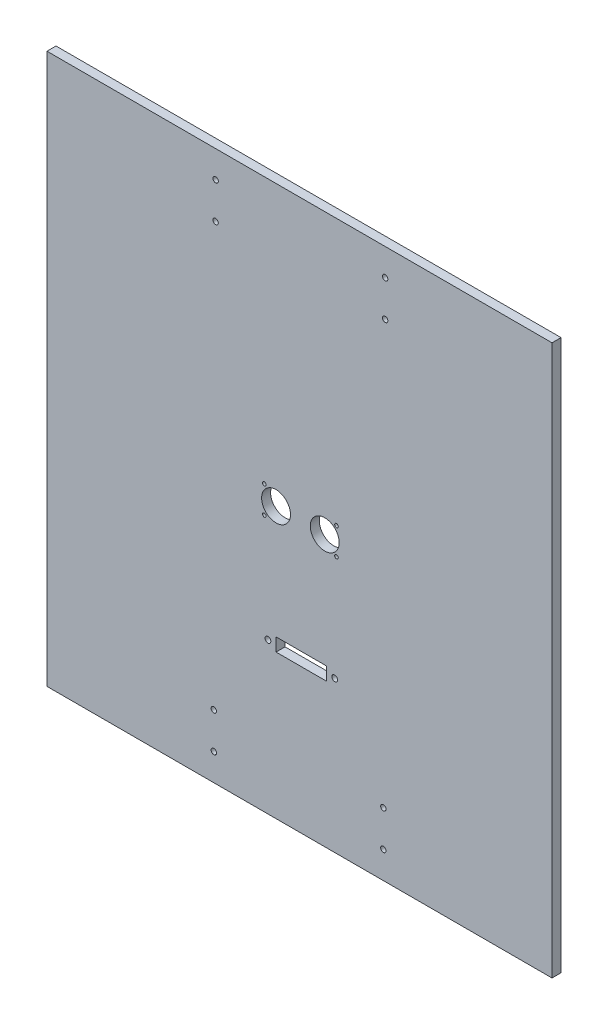
ISO-10303-21;
HEADER;
FILE_DESCRIPTION(('STEP AP214'),'2;1');
FILE_NAME('part.step','',(''),(''),'','','');
FILE_SCHEMA(('AUTOMOTIVE_DESIGN { 1 0 10303 214 1 1 1 1 }'));
ENDSEC;
DATA;
#1=APPLICATION_CONTEXT('core data for automotive mechanical design processes');
#2=APPLICATION_PROTOCOL_DEFINITION('international standard','automotive_design',2000,#1);
#3=PRODUCT_CONTEXT('',#1,'mechanical');
#4=PRODUCT('Part','Part','',(#3));
#5=PRODUCT_RELATED_PRODUCT_CATEGORY('part','',(#4));
#6=PRODUCT_DEFINITION_FORMATION('','',#4);
#7=PRODUCT_DEFINITION_CONTEXT('part definition',#1,'design');
#8=PRODUCT_DEFINITION('design','',#6,#7);
#9=PRODUCT_DEFINITION_SHAPE('','',#8);
#10=(LENGTH_UNIT() NAMED_UNIT(*) SI_UNIT(.MILLI.,.METRE.));
#11=(NAMED_UNIT(*) PLANE_ANGLE_UNIT() SI_UNIT($,.RADIAN.));
#12=(NAMED_UNIT(*) SI_UNIT($,.STERADIAN.) SOLID_ANGLE_UNIT());
#13=UNCERTAINTY_MEASURE_WITH_UNIT(LENGTH_MEASURE(1.E-05),#10,'distance_accuracy_value','');
#14=(GEOMETRIC_REPRESENTATION_CONTEXT(3) GLOBAL_UNCERTAINTY_ASSIGNED_CONTEXT((#13)) GLOBAL_UNIT_ASSIGNED_CONTEXT((#10,
#11,#12)) REPRESENTATION_CONTEXT('',''));
#15=CARTESIAN_POINT('',(0.,0.,0.));
#16=DIRECTION('',(0.,0.,1.));
#17=DIRECTION('',(1.,0.,0.));
#18=AXIS2_PLACEMENT_3D('',#15,#16,#17);
#19=CARTESIAN_POINT('',(0.,0.,5.));
#20=DIRECTION('',(1.,0.,0.));
#21=DIRECTION('',(0.,0.,-1.));
#22=AXIS2_PLACEMENT_3D('',#19,#20,#21);
#23=PLANE('',#22);
#24=DIRECTION('',(0.,-1.,0.));
#25=VECTOR('',#24,1.);
#26=CARTESIAN_POINT('',(0.,0.,0.));
#27=LINE('',#26,#25);
#28=CARTESIAN_POINT('',(0.,305.,0.));
#29=VERTEX_POINT('',#28);
#30=CARTESIAN_POINT('',(0.,0.,0.));
#31=VERTEX_POINT('',#30);
#32=EDGE_CURVE('E184',#29,#31,#27,.T.);
#33=ORIENTED_EDGE('',*,*,#32,.T.);
#34=DIRECTION('',(0.,0.,-1.));
#35=VECTOR('',#34,1.);
#36=CARTESIAN_POINT('',(0.,0.,5.));
#37=LINE('',#36,#35);
#38=CARTESIAN_POINT('',(0.,0.,5.));
#39=VERTEX_POINT('',#38);
#40=EDGE_CURVE('E11',#39,#31,#37,.T.);
#41=ORIENTED_EDGE('',*,*,#40,.F.);
#42=DIRECTION('',(0.,-1.,0.));
#43=VECTOR('',#42,1.);
#44=CARTESIAN_POINT('',(0.,0.,5.));
#45=LINE('',#44,#43);
#46=CARTESIAN_POINT('',(0.,305.,5.));
#47=VERTEX_POINT('',#46);
#48=EDGE_CURVE('E187',#47,#39,#45,.T.);
#49=ORIENTED_EDGE('',*,*,#48,.F.);
#50=DIRECTION('',(0.,0.,-1.));
#51=VECTOR('',#50,1.);
#52=CARTESIAN_POINT('',(0.,305.,5.));
#53=LINE('',#52,#51);
#54=EDGE_CURVE('E197',#47,#29,#53,.T.);
#55=ORIENTED_EDGE('',*,*,#54,.T.);
#56=EDGE_LOOP('',(#33,#41,#49,#55));
#57=FACE_BOUND('',#56,.T.);
#58=ADVANCED_FACE('F34',(#57),#23,.F.);
#59=CARTESIAN_POINT('',(0.,0.,5.));
#60=DIRECTION('',(0.,1.,0.));
#61=DIRECTION('',(0.,0.,1.));
#62=AXIS2_PLACEMENT_3D('',#59,#60,#61);
#63=PLANE('',#62);
#64=DIRECTION('',(1.,0.,0.));
#65=VECTOR('',#64,1.);
#66=CARTESIAN_POINT('',(0.,0.,0.));
#67=LINE('',#66,#65);
#68=CARTESIAN_POINT('',(280.,0.,0.));
#69=VERTEX_POINT('',#68);
#70=EDGE_CURVE('E200',#31,#69,#67,.T.);
#71=ORIENTED_EDGE('',*,*,#70,.T.);
#72=DIRECTION('',(0.,0.,-1.));
#73=VECTOR('',#72,1.);
#74=CARTESIAN_POINT('',(280.,0.,5.));
#75=LINE('',#74,#73);
#76=CARTESIAN_POINT('',(280.,0.,5.));
#77=VERTEX_POINT('',#76);
#78=EDGE_CURVE('E41',#77,#69,#75,.T.);
#79=ORIENTED_EDGE('',*,*,#78,.F.);
#80=DIRECTION('',(1.,0.,0.));
#81=VECTOR('',#80,1.);
#82=CARTESIAN_POINT('',(0.,0.,5.));
#83=LINE('',#82,#81);
#84=EDGE_CURVE('E190',#39,#77,#83,.T.);
#85=ORIENTED_EDGE('',*,*,#84,.F.);
#86=ORIENTED_EDGE('',*,*,#40,.T.);
#87=EDGE_LOOP('',(#71,#79,#85,#86));
#88=FACE_BOUND('',#87,.T.);
#89=ADVANCED_FACE('F229',(#88),#63,.F.);
#90=CARTESIAN_POINT('',(280.,0.,5.));
#91=DIRECTION('',(-1.,0.,0.));
#92=DIRECTION('',(0.,0.,1.));
#93=AXIS2_PLACEMENT_3D('',#90,#91,#92);
#94=PLANE('',#93);
#95=DIRECTION('',(0.,1.,0.));
#96=VECTOR('',#95,1.);
#97=CARTESIAN_POINT('',(280.,0.,0.));
#98=LINE('',#97,#96);
#99=CARTESIAN_POINT('',(280.,305.,0.));
#100=VERTEX_POINT('',#99);
#101=EDGE_CURVE('E202',#69,#100,#98,.T.);
#102=ORIENTED_EDGE('',*,*,#101,.T.);
#103=DIRECTION('',(0.,0.,-1.));
#104=VECTOR('',#103,1.);
#105=CARTESIAN_POINT('',(280.,305.,5.));
#106=LINE('',#105,#104);
#107=CARTESIAN_POINT('',(280.,305.,5.));
#108=VERTEX_POINT('',#107);
#109=EDGE_CURVE('E207',#108,#100,#106,.T.);
#110=ORIENTED_EDGE('',*,*,#109,.F.);
#111=DIRECTION('',(0.,1.,0.));
#112=VECTOR('',#111,1.);
#113=CARTESIAN_POINT('',(280.,0.,5.));
#114=LINE('',#113,#112);
#115=EDGE_CURVE('E193',#77,#108,#114,.T.);
#116=ORIENTED_EDGE('',*,*,#115,.F.);
#117=ORIENTED_EDGE('',*,*,#78,.T.);
#118=EDGE_LOOP('',(#102,#110,#116,#117));
#119=FACE_BOUND('',#118,.T.);
#120=ADVANCED_FACE('F214',(#119),#94,.F.);
#121=CARTESIAN_POINT('',(0.,305.,5.));
#122=DIRECTION('',(0.,-1.,0.));
#123=DIRECTION('',(0.,0.,-1.));
#124=AXIS2_PLACEMENT_3D('',#121,#122,#123);
#125=PLANE('',#124);
#126=DIRECTION('',(-1.,0.,0.));
#127=VECTOR('',#126,1.);
#128=CARTESIAN_POINT('',(0.,305.,0.));
#129=LINE('',#128,#127);
#130=EDGE_CURVE('E191',#100,#29,#129,.T.);
#131=ORIENTED_EDGE('',*,*,#130,.T.);
#132=ORIENTED_EDGE('',*,*,#54,.F.);
#133=DIRECTION('',(-1.,0.,0.));
#134=VECTOR('',#133,1.);
#135=CARTESIAN_POINT('',(0.,305.,5.));
#136=LINE('',#135,#134);
#137=EDGE_CURVE('E195',#108,#47,#136,.T.);
#138=ORIENTED_EDGE('',*,*,#137,.F.);
#139=ORIENTED_EDGE('',*,*,#109,.T.);
#140=EDGE_LOOP('',(#131,#132,#138,#139));
#141=FACE_BOUND('',#140,.T.);
#142=ADVANCED_FACE('F223',(#141),#125,.F.);
#143=CARTESIAN_POINT('',(0.,0.,5.));
#144=DIRECTION('',(0.,0.,-1.));
#145=DIRECTION('',(-1.,0.,0.));
#146=AXIS2_PLACEMENT_3D('',#143,#144,#145);
#147=PLANE('',#146);
#148=CARTESIAN_POINT('',(160.498818514666,142.491467645309,5.));
#149=DIRECTION('',(0.,0.,-1.));
#150=DIRECTION('',(-1.,0.,0.));
#151=AXIS2_PLACEMENT_3D('',#148,#149,#150);
#152=CIRCLE('',#151,0.999999999999998);
#153=CARTESIAN_POINT('',(159.498818514666,142.491467645309,5.));
#154=VERTEX_POINT('',#153);
#155=EDGE_CURVE('E339',#154,#154,#152,.T.);
#156=ORIENTED_EDGE('',*,*,#155,.T.);
#157=EDGE_LOOP('',(#156));
#158=FACE_BOUND('',#157,.T.);
#159=CARTESIAN_POINT('',(120.498818514666,142.502017665616,5.));
#160=DIRECTION('',(0.,0.,-1.));
#161=DIRECTION('',(-1.,0.,0.));
#162=AXIS2_PLACEMENT_3D('',#159,#160,#161);
#163=CIRCLE('',#162,0.999999999999998);
#164=CARTESIAN_POINT('',(119.498818514666,142.502017665616,5.));
#165=VERTEX_POINT('',#164);
#166=EDGE_CURVE('E329',#165,#165,#163,.T.);
#167=ORIENTED_EDGE('',*,*,#166,.T.);
#168=EDGE_LOOP('',(#167));
#169=FACE_BOUND('',#168,.T.);
#170=CARTESIAN_POINT('',(120.502645847871,157.515062528472,5.));
#171=DIRECTION('',(0.,0.,-1.));
#172=DIRECTION('',(-1.,0.,0.));
#173=AXIS2_PLACEMENT_3D('',#170,#171,#172);
#174=CIRCLE('',#173,0.999999999999998);
#175=CARTESIAN_POINT('',(119.502645847871,157.515062528472,5.));
#176=VERTEX_POINT('',#175);
#177=EDGE_CURVE('E324',#176,#176,#174,.T.);
#178=ORIENTED_EDGE('',*,*,#177,.T.);
#179=EDGE_LOOP('',(#178));
#180=FACE_BOUND('',#179,.T.);
#181=CARTESIAN_POINT('',(160.502638888889,157.491467645309,5.));
#182=DIRECTION('',(0.,0.,-1.));
#183=DIRECTION('',(-1.,0.,0.));
#184=AXIS2_PLACEMENT_3D('',#181,#182,#183);
#185=CIRCLE('',#184,0.999999999999998);
#186=CARTESIAN_POINT('',(159.502638888889,157.491467645309,5.));
#187=VERTEX_POINT('',#186);
#188=EDGE_CURVE('E352',#187,#187,#185,.T.);
#189=ORIENTED_EDGE('',*,*,#188,.T.);
#190=EDGE_LOOP('',(#189));
#191=FACE_BOUND('',#190,.T.);
#192=CARTESIAN_POINT('',(127.,150.,5.));
#193=DIRECTION('',(0.,0.,-1.));
#194=DIRECTION('',(-1.,0.,0.));
#195=AXIS2_PLACEMENT_3D('',#192,#193,#194);
#196=CIRCLE('',#195,8.00000000000004);
#197=CARTESIAN_POINT('',(119.,150.,5.));
#198=VERTEX_POINT('',#197);
#199=EDGE_CURVE('E345',#198,#198,#196,.T.);
#200=ORIENTED_EDGE('',*,*,#199,.T.);
#201=EDGE_LOOP('',(#200));
#202=FACE_BOUND('',#201,.T.);
#203=CARTESIAN_POINT('',(154.,150.,5.));
#204=DIRECTION('',(0.,0.,-1.));
#205=DIRECTION('',(-1.,0.,0.));
#206=AXIS2_PLACEMENT_3D('',#203,#204,#205);
#207=CIRCLE('',#206,8.00000000000001);
#208=CARTESIAN_POINT('',(146.,150.,5.));
#209=VERTEX_POINT('',#208);
#210=EDGE_CURVE('E357',#209,#209,#207,.T.);
#211=ORIENTED_EDGE('',*,*,#210,.T.);
#212=EDGE_LOOP('',(#211));
#213=FACE_BOUND('',#212,.T.);
#214=CARTESIAN_POINT('',(159.5,83.65,5.));
#215=DIRECTION('',(0.,0.,-1.));
#216=DIRECTION('',(-1.,0.,0.));
#217=AXIS2_PLACEMENT_3D('',#214,#215,#216);
#218=CIRCLE('',#217,1.59999999999999);
#219=CARTESIAN_POINT('',(157.9,83.65,5.));
#220=VERTEX_POINT('',#219);
#221=EDGE_CURVE('E129',#220,#220,#218,.T.);
#222=ORIENTED_EDGE('',*,*,#221,.T.);
#223=EDGE_LOOP('',(#222));
#224=FACE_BOUND('',#223,.T.);
#225=CARTESIAN_POINT('',(122.5,83.65,5.));
#226=DIRECTION('',(0.,0.,-1.));
#227=DIRECTION('',(-1.,0.,0.));
#228=AXIS2_PLACEMENT_3D('',#225,#226,#227);
#229=CIRCLE('',#228,1.60000000000001);
#230=CARTESIAN_POINT('',(120.9,83.65,5.));
#231=VERTEX_POINT('',#230);
#232=EDGE_CURVE('E366',#231,#231,#229,.T.);
#233=ORIENTED_EDGE('',*,*,#232,.T.);
#234=EDGE_LOOP('',(#233));
#235=FACE_BOUND('',#234,.T.);
#236=DIRECTION('',(1.,0.,0.));
#237=VECTOR('',#236,1.);
#238=CARTESIAN_POINT('',(155.,87.3,5.));
#239=LINE('',#238,#237);
#240=CARTESIAN_POINT('',(127.,87.3,5.));
#241=VERTEX_POINT('',#240);
#242=CARTESIAN_POINT('',(155.,87.3,5.));
#243=VERTEX_POINT('',#242);
#244=EDGE_CURVE('E106',#241,#243,#239,.T.);
#245=ORIENTED_EDGE('',*,*,#244,.T.);
#246=DIRECTION('',(0.,-1.,0.));
#247=VECTOR('',#246,1.);
#248=CARTESIAN_POINT('',(155.,87.3,5.));
#249=LINE('',#248,#247);
#250=CARTESIAN_POINT('',(155.,80.,5.));
#251=VERTEX_POINT('',#250);
#252=EDGE_CURVE('E100',#243,#251,#249,.T.);
#253=ORIENTED_EDGE('',*,*,#252,.T.);
#254=DIRECTION('',(-1.,0.,0.));
#255=VECTOR('',#254,1.);
#256=CARTESIAN_POINT('',(155.,80.,5.));
#257=LINE('',#256,#255);
#258=CARTESIAN_POINT('',(127.,80.,5.));
#259=VERTEX_POINT('',#258);
#260=EDGE_CURVE('E109',#251,#259,#257,.T.);
#261=ORIENTED_EDGE('',*,*,#260,.T.);
#262=DIRECTION('',(0.,1.,0.));
#263=VECTOR('',#262,1.);
#264=CARTESIAN_POINT('',(127.,87.3,5.));
#265=LINE('',#264,#263);
#266=EDGE_CURVE('E48',#259,#241,#265,.T.);
#267=ORIENTED_EDGE('',*,*,#266,.T.);
#268=EDGE_LOOP('',(#245,#253,#261,#267));
#269=FACE_BOUND('',#268,.T.);
#270=CARTESIAN_POINT('',(187.5,290.,5.));
#271=DIRECTION('',(0.,0.,1.));
#272=DIRECTION('',(1.,0.,0.));
#273=AXIS2_PLACEMENT_3D('',#270,#271,#272);
#274=CIRCLE('',#273,1.5);
#275=CARTESIAN_POINT('',(189.,290.,5.));
#276=VERTEX_POINT('',#275);
#277=EDGE_CURVE('E143',#276,#276,#274,.T.);
#278=ORIENTED_EDGE('',*,*,#277,.F.);
#279=EDGE_LOOP('',(#278));
#280=FACE_BOUND('',#279,.T.);
#281=CARTESIAN_POINT('',(93.4999999999991,270.,5.));
#282=DIRECTION('',(0.,0.,1.));
#283=DIRECTION('',(1.,0.,0.));
#284=AXIS2_PLACEMENT_3D('',#281,#282,#283);
#285=CIRCLE('',#284,1.5);
#286=CARTESIAN_POINT('',(94.9999999999992,270.,5.));
#287=VERTEX_POINT('',#286);
#288=EDGE_CURVE('E149',#287,#287,#285,.T.);
#289=ORIENTED_EDGE('',*,*,#288,.F.);
#290=EDGE_LOOP('',(#289));
#291=FACE_BOUND('',#290,.T.);
#292=CARTESIAN_POINT('',(93.4999999999992,290.,5.));
#293=DIRECTION('',(0.,0.,1.));
#294=DIRECTION('',(1.,0.,0.));
#295=AXIS2_PLACEMENT_3D('',#292,#293,#294);
#296=CIRCLE('',#295,1.5);
#297=CARTESIAN_POINT('',(94.9999999999992,290.,5.));
#298=VERTEX_POINT('',#297);
#299=EDGE_CURVE('E135',#298,#298,#296,.T.);
#300=ORIENTED_EDGE('',*,*,#299,.F.);
#301=EDGE_LOOP('',(#300));
#302=FACE_BOUND('',#301,.T.);
#303=CARTESIAN_POINT('',(187.5,270.,5.));
#304=DIRECTION('',(0.,0.,1.));
#305=DIRECTION('',(1.,0.,0.));
#306=AXIS2_PLACEMENT_3D('',#303,#304,#305);
#307=CIRCLE('',#306,1.5);
#308=CARTESIAN_POINT('',(189.,270.,5.));
#309=VERTEX_POINT('',#308);
#310=EDGE_CURVE('E142',#309,#309,#307,.T.);
#311=ORIENTED_EDGE('',*,*,#310,.F.);
#312=EDGE_LOOP('',(#311));
#313=FACE_BOUND('',#312,.T.);
#314=CARTESIAN_POINT('',(92.4999999999993,15.,5.));
#315=DIRECTION('',(0.,0.,1.));
#316=DIRECTION('',(1.,0.,0.));
#317=AXIS2_PLACEMENT_3D('',#314,#315,#316);
#318=CIRCLE('',#317,1.5);
#319=CARTESIAN_POINT('',(93.9999999999993,15.,5.));
#320=VERTEX_POINT('',#319);
#321=EDGE_CURVE('E167',#320,#320,#318,.T.);
#322=ORIENTED_EDGE('',*,*,#321,.F.);
#323=EDGE_LOOP('',(#322));
#324=FACE_BOUND('',#323,.T.);
#325=CARTESIAN_POINT('',(186.5,35.,5.));
#326=DIRECTION('',(0.,0.,1.));
#327=DIRECTION('',(1.,0.,0.));
#328=AXIS2_PLACEMENT_3D('',#325,#326,#327);
#329=CIRCLE('',#328,1.5);
#330=CARTESIAN_POINT('',(188.,35.,5.));
#331=VERTEX_POINT('',#330);
#332=EDGE_CURVE('E173',#331,#331,#329,.T.);
#333=ORIENTED_EDGE('',*,*,#332,.F.);
#334=EDGE_LOOP('',(#333));
#335=FACE_BOUND('',#334,.T.);
#336=CARTESIAN_POINT('',(186.5,15.,5.));
#337=DIRECTION('',(0.,0.,1.));
#338=DIRECTION('',(1.,0.,0.));
#339=AXIS2_PLACEMENT_3D('',#336,#337,#338);
#340=CIRCLE('',#339,1.5);
#341=CARTESIAN_POINT('',(188.,15.,5.));
#342=VERTEX_POINT('',#341);
#343=EDGE_CURVE('E160',#342,#342,#340,.T.);
#344=ORIENTED_EDGE('',*,*,#343,.F.);
#345=EDGE_LOOP('',(#344));
#346=FACE_BOUND('',#345,.T.);
#347=CARTESIAN_POINT('',(92.4999999999993,35.,5.));
#348=DIRECTION('',(0.,0.,1.));
#349=DIRECTION('',(1.,0.,0.));
#350=AXIS2_PLACEMENT_3D('',#347,#348,#349);
#351=CIRCLE('',#350,1.5);
#352=CARTESIAN_POINT('',(93.9999999999993,35.,5.));
#353=VERTEX_POINT('',#352);
#354=EDGE_CURVE('E166',#353,#353,#351,.T.);
#355=ORIENTED_EDGE('',*,*,#354,.F.);
#356=EDGE_LOOP('',(#355));
#357=FACE_BOUND('',#356,.T.);
#358=ORIENTED_EDGE('',*,*,#48,.T.);
#359=ORIENTED_EDGE('',*,*,#84,.T.);
#360=ORIENTED_EDGE('',*,*,#115,.T.);
#361=ORIENTED_EDGE('',*,*,#137,.T.);
#362=EDGE_LOOP('',(#358,#359,#360,#361));
#363=FACE_BOUND('',#362,.T.);
#364=ADVANCED_FACE('F113',(#158,#169,#180,#191,#202,#213,#224,#235,#269,#280,#291,#302,#313,
#324,#335,#346,#357,#363),#147,.F.);
#365=CARTESIAN_POINT('',(0.,0.,0.));
#366=DIRECTION('',(0.,0.,-1.));
#367=DIRECTION('',(-1.,0.,0.));
#368=AXIS2_PLACEMENT_3D('',#365,#366,#367);
#369=PLANE('',#368);
#370=CARTESIAN_POINT('',(160.498818514666,142.491467645309,0.));
#371=DIRECTION('',(0.,0.,-1.));
#372=DIRECTION('',(-1.,0.,0.));
#373=AXIS2_PLACEMENT_3D('',#370,#371,#372);
#374=CIRCLE('',#373,0.999999999999998);
#375=CARTESIAN_POINT('',(159.498818514666,142.491467645309,0.));
#376=VERTEX_POINT('',#375);
#377=EDGE_CURVE('E342',#376,#376,#374,.T.);
#378=ORIENTED_EDGE('',*,*,#377,.F.);
#379=EDGE_LOOP('',(#378));
#380=FACE_BOUND('',#379,.T.);
#381=CARTESIAN_POINT('',(120.498818514666,142.502017665616,0.));
#382=DIRECTION('',(0.,0.,-1.));
#383=DIRECTION('',(-1.,0.,0.));
#384=AXIS2_PLACEMENT_3D('',#381,#382,#383);
#385=CIRCLE('',#384,0.999999999999998);
#386=CARTESIAN_POINT('',(119.498818514666,142.502017665616,0.));
#387=VERTEX_POINT('',#386);
#388=EDGE_CURVE('E334',#387,#387,#385,.T.);
#389=ORIENTED_EDGE('',*,*,#388,.F.);
#390=EDGE_LOOP('',(#389));
#391=FACE_BOUND('',#390,.T.);
#392=CARTESIAN_POINT('',(120.502645847871,157.515062528472,0.));
#393=DIRECTION('',(0.,0.,-1.));
#394=DIRECTION('',(-1.,0.,0.));
#395=AXIS2_PLACEMENT_3D('',#392,#393,#394);
#396=CIRCLE('',#395,0.999999999999998);
#397=CARTESIAN_POINT('',(119.502645847871,157.515062528472,0.));
#398=VERTEX_POINT('',#397);
#399=EDGE_CURVE('E327',#398,#398,#396,.T.);
#400=ORIENTED_EDGE('',*,*,#399,.F.);
#401=EDGE_LOOP('',(#400));
#402=FACE_BOUND('',#401,.T.);
#403=CARTESIAN_POINT('',(160.502638888889,157.491467645309,0.));
#404=DIRECTION('',(0.,0.,-1.));
#405=DIRECTION('',(-1.,0.,0.));
#406=AXIS2_PLACEMENT_3D('',#403,#404,#405);
#407=CIRCLE('',#406,0.999999999999998);
#408=CARTESIAN_POINT('',(159.502638888889,157.491467645309,0.));
#409=VERTEX_POINT('',#408);
#410=EDGE_CURVE('E331',#409,#409,#407,.T.);
#411=ORIENTED_EDGE('',*,*,#410,.F.);
#412=EDGE_LOOP('',(#411));
#413=FACE_BOUND('',#412,.T.);
#414=CARTESIAN_POINT('',(127.,150.,0.));
#415=DIRECTION('',(0.,0.,-1.));
#416=DIRECTION('',(-1.,0.,0.));
#417=AXIS2_PLACEMENT_3D('',#414,#415,#416);
#418=CIRCLE('',#417,8.00000000000004);
#419=CARTESIAN_POINT('',(119.,150.,0.));
#420=VERTEX_POINT('',#419);
#421=EDGE_CURVE('E349',#420,#420,#418,.T.);
#422=ORIENTED_EDGE('',*,*,#421,.F.);
#423=EDGE_LOOP('',(#422));
#424=FACE_BOUND('',#423,.T.);
#425=CARTESIAN_POINT('',(154.,150.,0.));
#426=DIRECTION('',(0.,0.,-1.));
#427=DIRECTION('',(-1.,0.,0.));
#428=AXIS2_PLACEMENT_3D('',#425,#426,#427);
#429=CIRCLE('',#428,8.00000000000001);
#430=CARTESIAN_POINT('',(146.,150.,0.));
#431=VERTEX_POINT('',#430);
#432=EDGE_CURVE('E348',#431,#431,#429,.T.);
#433=ORIENTED_EDGE('',*,*,#432,.F.);
#434=EDGE_LOOP('',(#433));
#435=FACE_BOUND('',#434,.T.);
#436=CARTESIAN_POINT('',(159.5,83.65,0.));
#437=DIRECTION('',(0.,0.,-1.));
#438=DIRECTION('',(-1.,0.,0.));
#439=AXIS2_PLACEMENT_3D('',#436,#437,#438);
#440=CIRCLE('',#439,1.59999999999999);
#441=CARTESIAN_POINT('',(157.9,83.65,0.));
#442=VERTEX_POINT('',#441);
#443=EDGE_CURVE('E364',#442,#442,#440,.T.);
#444=ORIENTED_EDGE('',*,*,#443,.F.);
#445=EDGE_LOOP('',(#444));
#446=FACE_BOUND('',#445,.T.);
#447=CARTESIAN_POINT('',(122.5,83.65,0.));
#448=DIRECTION('',(0.,0.,-1.));
#449=DIRECTION('',(-1.,0.,0.));
#450=AXIS2_PLACEMENT_3D('',#447,#448,#449);
#451=CIRCLE('',#450,1.60000000000001);
#452=CARTESIAN_POINT('',(120.9,83.65,0.));
#453=VERTEX_POINT('',#452);
#454=EDGE_CURVE('E122',#453,#453,#451,.T.);
#455=ORIENTED_EDGE('',*,*,#454,.F.);
#456=EDGE_LOOP('',(#455));
#457=FACE_BOUND('',#456,.T.);
#458=DIRECTION('',(0.,-1.,0.));
#459=VECTOR('',#458,1.);
#460=CARTESIAN_POINT('',(155.,87.3,0.));
#461=LINE('',#460,#459);
#462=CARTESIAN_POINT('',(155.,87.3,0.));
#463=VERTEX_POINT('',#462);
#464=CARTESIAN_POINT('',(155.,80.,0.));
#465=VERTEX_POINT('',#464);
#466=EDGE_CURVE('E56',#463,#465,#461,.T.);
#467=ORIENTED_EDGE('',*,*,#466,.F.);
#468=DIRECTION('',(1.,0.,0.));
#469=VECTOR('',#468,1.);
#470=CARTESIAN_POINT('',(155.,87.3,0.));
#471=LINE('',#470,#469);
#472=CARTESIAN_POINT('',(127.,87.3,0.));
#473=VERTEX_POINT('',#472);
#474=EDGE_CURVE('E116',#473,#463,#471,.T.);
#475=ORIENTED_EDGE('',*,*,#474,.F.);
#476=DIRECTION('',(0.,1.,0.));
#477=VECTOR('',#476,1.);
#478=CARTESIAN_POINT('',(127.,87.3,0.));
#479=LINE('',#478,#477);
#480=CARTESIAN_POINT('',(127.,80.,0.));
#481=VERTEX_POINT('',#480);
#482=EDGE_CURVE('E119',#481,#473,#479,.T.);
#483=ORIENTED_EDGE('',*,*,#482,.F.);
#484=DIRECTION('',(-1.,0.,0.));
#485=VECTOR('',#484,1.);
#486=CARTESIAN_POINT('',(155.,80.,0.));
#487=LINE('',#486,#485);
#488=EDGE_CURVE('E128',#465,#481,#487,.T.);
#489=ORIENTED_EDGE('',*,*,#488,.F.);
#490=EDGE_LOOP('',(#467,#475,#483,#489));
#491=FACE_BOUND('',#490,.T.);
#492=CARTESIAN_POINT('',(187.5,290.,0.));
#493=DIRECTION('',(0.,0.,1.));
#494=DIRECTION('',(1.,0.,0.));
#495=AXIS2_PLACEMENT_3D('',#492,#493,#494);
#496=CIRCLE('',#495,1.5);
#497=CARTESIAN_POINT('',(189.,290.,0.));
#498=VERTEX_POINT('',#497);
#499=EDGE_CURVE('E139',#498,#498,#496,.T.);
#500=ORIENTED_EDGE('',*,*,#499,.T.);
#501=EDGE_LOOP('',(#500));
#502=FACE_BOUND('',#501,.T.);
#503=CARTESIAN_POINT('',(93.4999999999991,270.,0.));
#504=DIRECTION('',(0.,0.,1.));
#505=DIRECTION('',(1.,0.,0.));
#506=AXIS2_PLACEMENT_3D('',#503,#504,#505);
#507=CIRCLE('',#506,1.5);
#508=CARTESIAN_POINT('',(94.9999999999992,270.,0.));
#509=VERTEX_POINT('',#508);
#510=EDGE_CURVE('E146',#509,#509,#507,.T.);
#511=ORIENTED_EDGE('',*,*,#510,.T.);
#512=EDGE_LOOP('',(#511));
#513=FACE_BOUND('',#512,.T.);
#514=CARTESIAN_POINT('',(93.4999999999992,290.,0.));
#515=DIRECTION('',(0.,0.,1.));
#516=DIRECTION('',(1.,0.,0.));
#517=AXIS2_PLACEMENT_3D('',#514,#515,#516);
#518=CIRCLE('',#517,1.5);
#519=CARTESIAN_POINT('',(94.9999999999992,290.,0.));
#520=VERTEX_POINT('',#519);
#521=EDGE_CURVE('E152',#520,#520,#518,.T.);
#522=ORIENTED_EDGE('',*,*,#521,.T.);
#523=EDGE_LOOP('',(#522));
#524=FACE_BOUND('',#523,.T.);
#525=CARTESIAN_POINT('',(187.5,270.,0.));
#526=DIRECTION('',(0.,0.,1.));
#527=DIRECTION('',(1.,0.,0.));
#528=AXIS2_PLACEMENT_3D('',#525,#526,#527);
#529=CIRCLE('',#528,1.5);
#530=CARTESIAN_POINT('',(189.,270.,0.));
#531=VERTEX_POINT('',#530);
#532=EDGE_CURVE('E157',#531,#531,#529,.T.);
#533=ORIENTED_EDGE('',*,*,#532,.T.);
#534=EDGE_LOOP('',(#533));
#535=FACE_BOUND('',#534,.T.);
#536=CARTESIAN_POINT('',(92.4999999999993,15.,0.));
#537=DIRECTION('',(0.,0.,1.));
#538=DIRECTION('',(1.,0.,0.));
#539=AXIS2_PLACEMENT_3D('',#536,#537,#538);
#540=CIRCLE('',#539,1.5);
#541=CARTESIAN_POINT('',(93.9999999999993,15.,0.));
#542=VERTEX_POINT('',#541);
#543=EDGE_CURVE('E163',#542,#542,#540,.T.);
#544=ORIENTED_EDGE('',*,*,#543,.T.);
#545=EDGE_LOOP('',(#544));
#546=FACE_BOUND('',#545,.T.);
#547=CARTESIAN_POINT('',(186.5,35.,0.));
#548=DIRECTION('',(0.,0.,1.));
#549=DIRECTION('',(1.,0.,0.));
#550=AXIS2_PLACEMENT_3D('',#547,#548,#549);
#551=CIRCLE('',#550,1.5);
#552=CARTESIAN_POINT('',(188.,35.,0.));
#553=VERTEX_POINT('',#552);
#554=EDGE_CURVE('E170',#553,#553,#551,.T.);
#555=ORIENTED_EDGE('',*,*,#554,.T.);
#556=EDGE_LOOP('',(#555));
#557=FACE_BOUND('',#556,.T.);
#558=CARTESIAN_POINT('',(186.5,15.,0.));
#559=DIRECTION('',(0.,0.,1.));
#560=DIRECTION('',(1.,0.,0.));
#561=AXIS2_PLACEMENT_3D('',#558,#559,#560);
#562=CIRCLE('',#561,1.5);
#563=CARTESIAN_POINT('',(188.,15.,0.));
#564=VERTEX_POINT('',#563);
#565=EDGE_CURVE('E176',#564,#564,#562,.T.);
#566=ORIENTED_EDGE('',*,*,#565,.T.);
#567=EDGE_LOOP('',(#566));
#568=FACE_BOUND('',#567,.T.);
#569=CARTESIAN_POINT('',(92.4999999999993,35.,0.));
#570=DIRECTION('',(0.,0.,1.));
#571=DIRECTION('',(1.,0.,0.));
#572=AXIS2_PLACEMENT_3D('',#569,#570,#571);
#573=CIRCLE('',#572,1.5);
#574=CARTESIAN_POINT('',(93.9999999999993,35.,0.));
#575=VERTEX_POINT('',#574);
#576=EDGE_CURVE('E181',#575,#575,#573,.T.);
#577=ORIENTED_EDGE('',*,*,#576,.T.);
#578=EDGE_LOOP('',(#577));
#579=FACE_BOUND('',#578,.T.);
#580=ORIENTED_EDGE('',*,*,#32,.F.);
#581=ORIENTED_EDGE('',*,*,#130,.F.);
#582=ORIENTED_EDGE('',*,*,#101,.F.);
#583=ORIENTED_EDGE('',*,*,#70,.F.);
#584=EDGE_LOOP('',(#580,#581,#582,#583));
#585=FACE_BOUND('',#584,.T.);
#586=ADVANCED_FACE('F220',(#380,#391,#402,#413,#424,#435,#446,#457,#491,#502,#513,#524,#535,
#546,#557,#568,#579,#585),#369,.T.);
#587=CARTESIAN_POINT('',(92.4999999999993,35.,0.));
#588=DIRECTION('',(0.,0.,1.));
#589=DIRECTION('',(1.,0.,0.));
#590=AXIS2_PLACEMENT_3D('',#587,#588,#589);
#591=CYLINDRICAL_SURFACE('',#590,1.5);
#592=ORIENTED_EDGE('',*,*,#576,.F.);
#593=EDGE_LOOP('',(#592));
#594=FACE_BOUND('',#593,.T.);
#595=ORIENTED_EDGE('',*,*,#354,.T.);
#596=EDGE_LOOP('',(#595));
#597=FACE_BOUND('',#596,.T.);
#598=ADVANCED_FACE('F241',(#594,#597),#591,.F.);
#599=CARTESIAN_POINT('',(186.5,15.,0.));
#600=DIRECTION('',(0.,0.,1.));
#601=DIRECTION('',(1.,0.,0.));
#602=AXIS2_PLACEMENT_3D('',#599,#600,#601);
#603=CYLINDRICAL_SURFACE('',#602,1.5);
#604=ORIENTED_EDGE('',*,*,#565,.F.);
#605=EDGE_LOOP('',(#604));
#606=FACE_BOUND('',#605,.T.);
#607=ORIENTED_EDGE('',*,*,#343,.T.);
#608=EDGE_LOOP('',(#607));
#609=FACE_BOUND('',#608,.T.);
#610=ADVANCED_FACE('F248',(#606,#609),#603,.F.);
#611=CARTESIAN_POINT('',(186.5,35.,0.));
#612=DIRECTION('',(0.,0.,1.));
#613=DIRECTION('',(1.,0.,0.));
#614=AXIS2_PLACEMENT_3D('',#611,#612,#613);
#615=CYLINDRICAL_SURFACE('',#614,1.5);
#616=ORIENTED_EDGE('',*,*,#554,.F.);
#617=EDGE_LOOP('',(#616));
#618=FACE_BOUND('',#617,.T.);
#619=ORIENTED_EDGE('',*,*,#332,.T.);
#620=EDGE_LOOP('',(#619));
#621=FACE_BOUND('',#620,.T.);
#622=ADVANCED_FACE('F252',(#618,#621),#615,.F.);
#623=CARTESIAN_POINT('',(92.4999999999993,15.,0.));
#624=DIRECTION('',(0.,0.,1.));
#625=DIRECTION('',(1.,0.,0.));
#626=AXIS2_PLACEMENT_3D('',#623,#624,#625);
#627=CYLINDRICAL_SURFACE('',#626,1.5);
#628=ORIENTED_EDGE('',*,*,#543,.F.);
#629=EDGE_LOOP('',(#628));
#630=FACE_BOUND('',#629,.T.);
#631=ORIENTED_EDGE('',*,*,#321,.T.);
#632=EDGE_LOOP('',(#631));
#633=FACE_BOUND('',#632,.T.);
#634=ADVANCED_FACE('F256',(#630,#633),#627,.F.);
#635=CARTESIAN_POINT('',(187.5,270.,0.));
#636=DIRECTION('',(0.,0.,1.));
#637=DIRECTION('',(1.,0.,0.));
#638=AXIS2_PLACEMENT_3D('',#635,#636,#637);
#639=CYLINDRICAL_SURFACE('',#638,1.5);
#640=ORIENTED_EDGE('',*,*,#532,.F.);
#641=EDGE_LOOP('',(#640));
#642=FACE_BOUND('',#641,.T.);
#643=ORIENTED_EDGE('',*,*,#310,.T.);
#644=EDGE_LOOP('',(#643));
#645=FACE_BOUND('',#644,.T.);
#646=ADVANCED_FACE('F260',(#642,#645),#639,.F.);
#647=CARTESIAN_POINT('',(93.4999999999992,290.,0.));
#648=DIRECTION('',(0.,0.,1.));
#649=DIRECTION('',(1.,0.,0.));
#650=AXIS2_PLACEMENT_3D('',#647,#648,#649);
#651=CYLINDRICAL_SURFACE('',#650,1.5);
#652=ORIENTED_EDGE('',*,*,#521,.F.);
#653=EDGE_LOOP('',(#652));
#654=FACE_BOUND('',#653,.T.);
#655=ORIENTED_EDGE('',*,*,#299,.T.);
#656=EDGE_LOOP('',(#655));
#657=FACE_BOUND('',#656,.T.);
#658=ADVANCED_FACE('F264',(#654,#657),#651,.F.);
#659=CARTESIAN_POINT('',(93.4999999999991,270.,0.));
#660=DIRECTION('',(0.,0.,1.));
#661=DIRECTION('',(1.,0.,0.));
#662=AXIS2_PLACEMENT_3D('',#659,#660,#661);
#663=CYLINDRICAL_SURFACE('',#662,1.5);
#664=ORIENTED_EDGE('',*,*,#510,.F.);
#665=EDGE_LOOP('',(#664));
#666=FACE_BOUND('',#665,.T.);
#667=ORIENTED_EDGE('',*,*,#288,.T.);
#668=EDGE_LOOP('',(#667));
#669=FACE_BOUND('',#668,.T.);
#670=ADVANCED_FACE('F268',(#666,#669),#663,.F.);
#671=CARTESIAN_POINT('',(187.5,290.,0.));
#672=DIRECTION('',(0.,0.,1.));
#673=DIRECTION('',(1.,0.,0.));
#674=AXIS2_PLACEMENT_3D('',#671,#672,#673);
#675=CYLINDRICAL_SURFACE('',#674,1.5);
#676=ORIENTED_EDGE('',*,*,#499,.F.);
#677=EDGE_LOOP('',(#676));
#678=FACE_BOUND('',#677,.T.);
#679=ORIENTED_EDGE('',*,*,#277,.T.);
#680=EDGE_LOOP('',(#679));
#681=FACE_BOUND('',#680,.T.);
#682=ADVANCED_FACE('F272',(#678,#681),#675,.F.);
#683=CARTESIAN_POINT('',(155.,87.3,5.));
#684=DIRECTION('',(1.,0.,0.));
#685=DIRECTION('',(0.,0.,-1.));
#686=AXIS2_PLACEMENT_3D('',#683,#684,#685);
#687=PLANE('',#686);
#688=ORIENTED_EDGE('',*,*,#466,.T.);
#689=DIRECTION('',(0.,0.,-1.));
#690=VECTOR('',#689,1.);
#691=CARTESIAN_POINT('',(155.,80.,5.));
#692=LINE('',#691,#690);
#693=EDGE_CURVE('E96',#251,#465,#692,.T.);
#694=ORIENTED_EDGE('',*,*,#693,.F.);
#695=ORIENTED_EDGE('',*,*,#252,.F.);
#696=DIRECTION('',(0.,0.,-1.));
#697=VECTOR('',#696,1.);
#698=CARTESIAN_POINT('',(155.,87.3,5.));
#699=LINE('',#698,#697);
#700=EDGE_CURVE('E133',#243,#463,#699,.T.);
#701=ORIENTED_EDGE('',*,*,#700,.T.);
#702=EDGE_LOOP('',(#688,#694,#695,#701));
#703=FACE_BOUND('',#702,.T.);
#704=ADVANCED_FACE('F98',(#703),#687,.F.);
#705=CARTESIAN_POINT('',(155.,87.3,5.));
#706=DIRECTION('',(0.,1.,0.));
#707=DIRECTION('',(0.,0.,1.));
#708=AXIS2_PLACEMENT_3D('',#705,#706,#707);
#709=PLANE('',#708);
#710=ORIENTED_EDGE('',*,*,#474,.T.);
#711=ORIENTED_EDGE('',*,*,#700,.F.);
#712=ORIENTED_EDGE('',*,*,#244,.F.);
#713=DIRECTION('',(0.,0.,-1.));
#714=VECTOR('',#713,1.);
#715=CARTESIAN_POINT('',(127.,87.3,5.));
#716=LINE('',#715,#714);
#717=EDGE_CURVE('E136',#241,#473,#716,.T.);
#718=ORIENTED_EDGE('',*,*,#717,.T.);
#719=EDGE_LOOP('',(#710,#711,#712,#718));
#720=FACE_BOUND('',#719,.T.);
#721=ADVANCED_FACE('F279',(#720),#709,.F.);
#722=CARTESIAN_POINT('',(127.,87.3,5.));
#723=DIRECTION('',(-1.,0.,0.));
#724=DIRECTION('',(0.,-1.,0.));
#725=AXIS2_PLACEMENT_3D('',#722,#723,#724);
#726=PLANE('',#725);
#727=ORIENTED_EDGE('',*,*,#482,.T.);
#728=ORIENTED_EDGE('',*,*,#717,.F.);
#729=ORIENTED_EDGE('',*,*,#266,.F.);
#730=DIRECTION('',(0.,0.,-1.));
#731=VECTOR('',#730,1.);
#732=CARTESIAN_POINT('',(127.,80.,5.));
#733=LINE('',#732,#731);
#734=EDGE_CURVE('E105',#259,#481,#733,.T.);
#735=ORIENTED_EDGE('',*,*,#734,.T.);
#736=EDGE_LOOP('',(#727,#728,#729,#735));
#737=FACE_BOUND('',#736,.T.);
#738=ADVANCED_FACE('F283',(#737),#726,.F.);
#739=CARTESIAN_POINT('',(155.,80.,5.));
#740=DIRECTION('',(0.,-1.,0.));
#741=DIRECTION('',(0.,0.,-1.));
#742=AXIS2_PLACEMENT_3D('',#739,#740,#741);
#743=PLANE('',#742);
#744=ORIENTED_EDGE('',*,*,#488,.T.);
#745=ORIENTED_EDGE('',*,*,#734,.F.);
#746=ORIENTED_EDGE('',*,*,#260,.F.);
#747=ORIENTED_EDGE('',*,*,#693,.T.);
#748=EDGE_LOOP('',(#744,#745,#746,#747));
#749=FACE_BOUND('',#748,.T.);
#750=ADVANCED_FACE('F110',(#749),#743,.F.);
#751=CARTESIAN_POINT('',(122.5,83.65,5.));
#752=DIRECTION('',(0.,0.,-1.));
#753=DIRECTION('',(-1.,0.,0.));
#754=AXIS2_PLACEMENT_3D('',#751,#752,#753);
#755=CYLINDRICAL_SURFACE('',#754,1.60000000000001);
#756=ORIENTED_EDGE('',*,*,#232,.F.);
#757=EDGE_LOOP('',(#756));
#758=FACE_BOUND('',#757,.T.);
#759=ORIENTED_EDGE('',*,*,#454,.T.);
#760=EDGE_LOOP('',(#759));
#761=FACE_BOUND('',#760,.T.);
#762=ADVANCED_FACE('F282',(#758,#761),#755,.F.);
#763=CARTESIAN_POINT('',(159.5,83.65,5.));
#764=DIRECTION('',(0.,0.,-1.));
#765=DIRECTION('',(-1.,0.,0.));
#766=AXIS2_PLACEMENT_3D('',#763,#764,#765);
#767=CYLINDRICAL_SURFACE('',#766,1.59999999999999);
#768=ORIENTED_EDGE('',*,*,#221,.F.);
#769=EDGE_LOOP('',(#768));
#770=FACE_BOUND('',#769,.T.);
#771=ORIENTED_EDGE('',*,*,#443,.T.);
#772=EDGE_LOOP('',(#771));
#773=FACE_BOUND('',#772,.T.);
#774=ADVANCED_FACE('F291',(#770,#773),#767,.F.);
#775=CARTESIAN_POINT('',(154.,150.,5.));
#776=DIRECTION('',(0.,0.,-1.));
#777=DIRECTION('',(-1.,0.,0.));
#778=AXIS2_PLACEMENT_3D('',#775,#776,#777);
#779=CYLINDRICAL_SURFACE('',#778,8.00000000000001);
#780=ORIENTED_EDGE('',*,*,#210,.F.);
#781=EDGE_LOOP('',(#780));
#782=FACE_BOUND('',#781,.T.);
#783=ORIENTED_EDGE('',*,*,#432,.T.);
#784=EDGE_LOOP('',(#783));
#785=FACE_BOUND('',#784,.T.);
#786=ADVANCED_FACE('F295',(#782,#785),#779,.F.);
#787=CARTESIAN_POINT('',(127.,150.,5.));
#788=DIRECTION('',(0.,0.,-1.));
#789=DIRECTION('',(-1.,0.,0.));
#790=AXIS2_PLACEMENT_3D('',#787,#788,#789);
#791=CYLINDRICAL_SURFACE('',#790,8.00000000000004);
#792=ORIENTED_EDGE('',*,*,#199,.F.);
#793=EDGE_LOOP('',(#792));
#794=FACE_BOUND('',#793,.T.);
#795=ORIENTED_EDGE('',*,*,#421,.T.);
#796=EDGE_LOOP('',(#795));
#797=FACE_BOUND('',#796,.T.);
#798=ADVANCED_FACE('F299',(#794,#797),#791,.F.);
#799=CARTESIAN_POINT('',(160.502638888889,157.491467645309,5.));
#800=DIRECTION('',(0.,0.,-1.));
#801=DIRECTION('',(-1.,0.,0.));
#802=AXIS2_PLACEMENT_3D('',#799,#800,#801);
#803=CYLINDRICAL_SURFACE('',#802,0.999999999999998);
#804=ORIENTED_EDGE('',*,*,#188,.F.);
#805=EDGE_LOOP('',(#804));
#806=FACE_BOUND('',#805,.T.);
#807=ORIENTED_EDGE('',*,*,#410,.T.);
#808=EDGE_LOOP('',(#807));
#809=FACE_BOUND('',#808,.T.);
#810=ADVANCED_FACE('F301',(#806,#809),#803,.F.);
#811=CARTESIAN_POINT('',(120.502645847871,157.515062528472,5.));
#812=DIRECTION('',(0.,0.,-1.));
#813=DIRECTION('',(-1.,0.,0.));
#814=AXIS2_PLACEMENT_3D('',#811,#812,#813);
#815=CYLINDRICAL_SURFACE('',#814,0.999999999999998);
#816=ORIENTED_EDGE('',*,*,#177,.F.);
#817=EDGE_LOOP('',(#816));
#818=FACE_BOUND('',#817,.T.);
#819=ORIENTED_EDGE('',*,*,#399,.T.);
#820=EDGE_LOOP('',(#819));
#821=FACE_BOUND('',#820,.T.);
#822=ADVANCED_FACE('F304',(#818,#821),#815,.F.);
#823=CARTESIAN_POINT('',(120.498818514666,142.502017665616,5.));
#824=DIRECTION('',(0.,0.,-1.));
#825=DIRECTION('',(-1.,0.,0.));
#826=AXIS2_PLACEMENT_3D('',#823,#824,#825);
#827=CYLINDRICAL_SURFACE('',#826,0.999999999999998);
#828=ORIENTED_EDGE('',*,*,#166,.F.);
#829=EDGE_LOOP('',(#828));
#830=FACE_BOUND('',#829,.T.);
#831=ORIENTED_EDGE('',*,*,#388,.T.);
#832=EDGE_LOOP('',(#831));
#833=FACE_BOUND('',#832,.T.);
#834=ADVANCED_FACE('F312',(#830,#833),#827,.F.);
#835=CARTESIAN_POINT('',(160.498818514666,142.491467645309,5.));
#836=DIRECTION('',(0.,0.,-1.));
#837=DIRECTION('',(-1.,0.,0.));
#838=AXIS2_PLACEMENT_3D('',#835,#836,#837);
#839=CYLINDRICAL_SURFACE('',#838,0.999999999999998);
#840=ORIENTED_EDGE('',*,*,#155,.F.);
#841=EDGE_LOOP('',(#840));
#842=FACE_BOUND('',#841,.T.);
#843=ORIENTED_EDGE('',*,*,#377,.T.);
#844=EDGE_LOOP('',(#843));
#845=FACE_BOUND('',#844,.T.);
#846=ADVANCED_FACE('F309',(#842,#845),#839,.F.);
#847=CLOSED_SHELL('',(#58,#89,#120,#142,#364,#586,#598,#610,#622,#634,#646,#658,#670,#682,#704,
#721,#738,#750,#762,#774,#786,#798,#810,#822,#834,#846));
#848=MANIFOLD_SOLID_BREP('B2',#847);
#849=ADVANCED_BREP_SHAPE_REPRESENTATION('',(#18,#848),#14);
#850=SHAPE_DEFINITION_REPRESENTATION(#9,#849);
ENDSEC;
END-ISO-10303-21;
